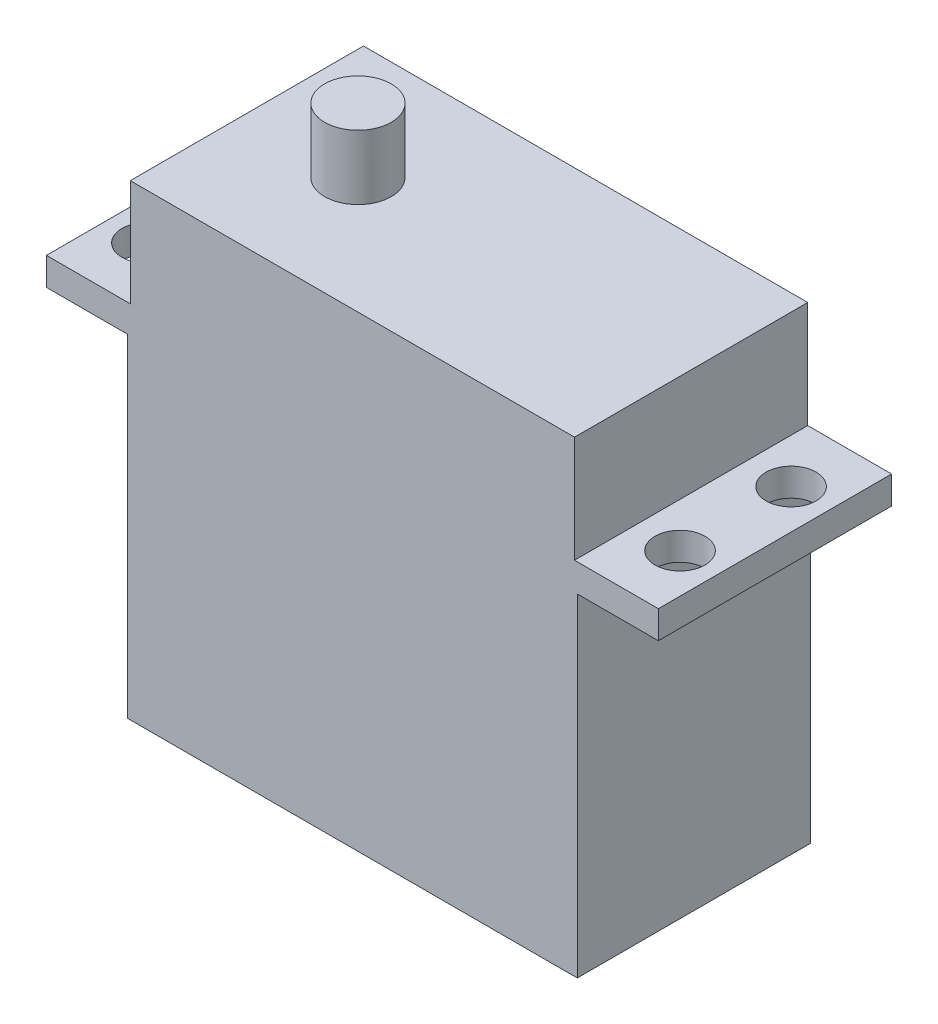
ISO-10303-21;
HEADER;
FILE_DESCRIPTION(('STEP AP214'),'2;1');
FILE_NAME('part.step','',(''),(''),'','','');
FILE_SCHEMA(('AUTOMOTIVE_DESIGN { 1 0 10303 214 1 1 1 1 }'));
ENDSEC;
DATA;
#1=APPLICATION_CONTEXT('core data for automotive mechanical design processes');
#2=APPLICATION_PROTOCOL_DEFINITION('international standard','automotive_design',2000,#1);
#3=PRODUCT_CONTEXT('',#1,'mechanical');
#4=PRODUCT('Part','Part','',(#3));
#5=PRODUCT_RELATED_PRODUCT_CATEGORY('part','',(#4));
#6=PRODUCT_DEFINITION_FORMATION('','',#4);
#7=PRODUCT_DEFINITION_CONTEXT('part definition',#1,'design');
#8=PRODUCT_DEFINITION('design','',#6,#7);
#9=PRODUCT_DEFINITION_SHAPE('','',#8);
#10=(LENGTH_UNIT() NAMED_UNIT(*) SI_UNIT(.MILLI.,.METRE.));
#11=(NAMED_UNIT(*) PLANE_ANGLE_UNIT() SI_UNIT($,.RADIAN.));
#12=(NAMED_UNIT(*) SI_UNIT($,.STERADIAN.) SOLID_ANGLE_UNIT());
#13=UNCERTAINTY_MEASURE_WITH_UNIT(LENGTH_MEASURE(1.E-05),#10,'distance_accuracy_value','');
#14=(GEOMETRIC_REPRESENTATION_CONTEXT(3) GLOBAL_UNCERTAINTY_ASSIGNED_CONTEXT((#13)) GLOBAL_UNIT_ASSIGNED_CONTEXT((#10,
#11,#12)) REPRESENTATION_CONTEXT('',''));
#15=CARTESIAN_POINT('',(0.,0.,0.));
#16=DIRECTION('',(0.,0.,1.));
#17=DIRECTION('',(1.,0.,0.));
#18=AXIS2_PLACEMENT_3D('',#15,#16,#17);
#19=CARTESIAN_POINT('',(0.,32.45,0.));
#20=DIRECTION('',(0.,-1.,0.));
#21=DIRECTION('',(0.,0.,-1.));
#22=AXIS2_PLACEMENT_3D('',#19,#20,#21);
#23=PLANE('',#22);
#24=CARTESIAN_POINT('',(24.,32.45,-5.));
#25=DIRECTION('',(0.,1.,0.));
#26=DIRECTION('',(0.,0.,1.));
#27=AXIS2_PLACEMENT_3D('',#24,#25,#26);
#28=CIRCLE('',#27,2.25);
#29=CARTESIAN_POINT('',(24.,32.45,-2.75));
#30=VERTEX_POINT('',#29);
#31=EDGE_CURVE('E190',#30,#30,#28,.T.);
#32=ORIENTED_EDGE('',*,*,#31,.F.);
#33=EDGE_LOOP('',(#32));
#34=FACE_BOUND('',#33,.T.);
#35=CARTESIAN_POINT('',(24.,32.45,5.));
#36=DIRECTION('',(0.,1.,0.));
#37=DIRECTION('',(0.,0.,-1.));
#38=AXIS2_PLACEMENT_3D('',#35,#36,#37);
#39=CIRCLE('',#38,2.25);
#40=CARTESIAN_POINT('',(24.,32.45,2.75));
#41=VERTEX_POINT('',#40);
#42=EDGE_CURVE('E184',#41,#41,#39,.T.);
#43=ORIENTED_EDGE('',*,*,#42,.F.);
#44=EDGE_LOOP('',(#43));
#45=FACE_BOUND('',#44,.T.);
#46=DIRECTION('',(0.,0.,-1.));
#47=VECTOR('',#46,1.);
#48=CARTESIAN_POINT('',(20.,32.45,10.5));
#49=LINE('',#48,#47);
#50=CARTESIAN_POINT('',(20.,32.45,10.5));
#51=VERTEX_POINT('',#50);
#52=CARTESIAN_POINT('',(20.,32.45,-10.5));
#53=VERTEX_POINT('',#52);
#54=EDGE_CURVE('E147',#51,#53,#49,.T.);
#55=ORIENTED_EDGE('',*,*,#54,.F.);
#56=DIRECTION('',(1.,0.,0.));
#57=VECTOR('',#56,1.);
#58=CARTESIAN_POINT('',(-20.25,32.45,10.5));
#59=LINE('',#58,#57);
#60=CARTESIAN_POINT('',(27.55,32.45,10.5));
#61=VERTEX_POINT('',#60);
#62=EDGE_CURVE('E220',#51,#61,#59,.T.);
#63=ORIENTED_EDGE('',*,*,#62,.T.);
#64=DIRECTION('',(0.,0.,-1.));
#65=VECTOR('',#64,1.);
#66=CARTESIAN_POINT('',(27.55,32.45,10.5));
#67=LINE('',#66,#65);
#68=CARTESIAN_POINT('',(27.55,32.45,-10.5));
#69=VERTEX_POINT('',#68);
#70=EDGE_CURVE('E196',#61,#69,#67,.T.);
#71=ORIENTED_EDGE('',*,*,#70,.T.);
#72=DIRECTION('',(-1.,0.,0.));
#73=VECTOR('',#72,1.);
#74=CARTESIAN_POINT('',(-20.25,32.45,-10.5));
#75=LINE('',#74,#73);
#76=EDGE_CURVE('E59',#69,#53,#75,.T.);
#77=ORIENTED_EDGE('',*,*,#76,.T.);
#78=EDGE_LOOP('',(#55,#63,#71,#77));
#79=FACE_BOUND('',#78,.T.);
#80=ADVANCED_FACE('F36',(#34,#45,#79),#23,.F.);
#81=CARTESIAN_POINT('',(-24.,32.45,5.));
#82=DIRECTION('',(0.,1.,0.));
#83=DIRECTION('',(0.,0.,1.));
#84=AXIS2_PLACEMENT_3D('',#81,#82,#83);
#85=CIRCLE('',#84,2.25);
#86=CARTESIAN_POINT('',(-24.,32.45,7.25));
#87=VERTEX_POINT('',#86);
#88=EDGE_CURVE('E158',#87,#87,#85,.T.);
#89=ORIENTED_EDGE('',*,*,#88,.F.);
#90=EDGE_LOOP('',(#89));
#91=FACE_BOUND('',#90,.T.);
#92=CARTESIAN_POINT('',(-24.,32.45,-5.));
#93=DIRECTION('',(0.,1.,0.));
#94=DIRECTION('',(0.,0.,-1.));
#95=AXIS2_PLACEMENT_3D('',#92,#93,#94);
#96=CIRCLE('',#95,2.25);
#97=CARTESIAN_POINT('',(-24.,32.45,-7.25));
#98=VERTEX_POINT('',#97);
#99=EDGE_CURVE('E148',#98,#98,#96,.T.);
#100=ORIENTED_EDGE('',*,*,#99,.F.);
#101=EDGE_LOOP('',(#100));
#102=FACE_BOUND('',#101,.T.);
#103=DIRECTION('',(0.,0.,1.));
#104=VECTOR('',#103,1.);
#105=CARTESIAN_POINT('',(-20.,32.45,10.5));
#106=LINE('',#105,#104);
#107=CARTESIAN_POINT('',(-20.,32.45,-10.5));
#108=VERTEX_POINT('',#107);
#109=CARTESIAN_POINT('',(-20.,32.45,10.5));
#110=VERTEX_POINT('',#109);
#111=EDGE_CURVE('E51',#108,#110,#106,.T.);
#112=ORIENTED_EDGE('',*,*,#111,.F.);
#113=CARTESIAN_POINT('',(-27.55,32.45,-10.5));
#114=VERTEX_POINT('',#113);
#115=EDGE_CURVE('E221',#108,#114,#75,.T.);
#116=ORIENTED_EDGE('',*,*,#115,.T.);
#117=DIRECTION('',(0.,0.,1.));
#118=VECTOR('',#117,1.);
#119=CARTESIAN_POINT('',(-27.55,32.45,10.5));
#120=LINE('',#119,#118);
#121=CARTESIAN_POINT('',(-27.55,32.45,10.5));
#122=VERTEX_POINT('',#121);
#123=EDGE_CURVE('E163',#114,#122,#120,.T.);
#124=ORIENTED_EDGE('',*,*,#123,.T.);
#125=EDGE_CURVE('E222',#122,#110,#59,.T.);
#126=ORIENTED_EDGE('',*,*,#125,.T.);
#127=EDGE_LOOP('',(#112,#116,#124,#126));
#128=FACE_BOUND('',#127,.T.);
#129=ADVANCED_FACE('F262',(#91,#102,#128),#23,.F.);
#130=CARTESIAN_POINT('',(20.25,32.45,10.5));
#131=DIRECTION('',(-1.,0.,0.));
#132=DIRECTION('',(0.,0.,1.));
#133=AXIS2_PLACEMENT_3D('',#130,#131,#132);
#134=PLANE('',#133);
#135=DIRECTION('',(0.,-1.,0.));
#136=VECTOR('',#135,1.);
#137=CARTESIAN_POINT('',(20.25,32.45,-10.5));
#138=LINE('',#137,#136);
#139=CARTESIAN_POINT('',(20.25,29.95,-10.5));
#140=VERTEX_POINT('',#139);
#141=CARTESIAN_POINT('',(20.25,0.,-10.5));
#142=VERTEX_POINT('',#141);
#143=EDGE_CURVE('E44',#140,#142,#138,.T.);
#144=ORIENTED_EDGE('',*,*,#143,.F.);
#145=DIRECTION('',(0.,0.,1.));
#146=VECTOR('',#145,1.);
#147=CARTESIAN_POINT('',(20.25,29.95,10.5));
#148=LINE('',#147,#146);
#149=CARTESIAN_POINT('',(20.25,29.95,10.5));
#150=VERTEX_POINT('',#149);
#151=EDGE_CURVE('E199',#140,#150,#148,.T.);
#152=ORIENTED_EDGE('',*,*,#151,.T.);
#153=DIRECTION('',(0.,-1.,0.));
#154=VECTOR('',#153,1.);
#155=CARTESIAN_POINT('',(20.25,32.45,10.5));
#156=LINE('',#155,#154);
#157=CARTESIAN_POINT('',(20.25,0.,10.5));
#158=VERTEX_POINT('',#157);
#159=EDGE_CURVE('E224',#150,#158,#156,.T.);
#160=ORIENTED_EDGE('',*,*,#159,.T.);
#161=DIRECTION('',(0.,0.,-1.));
#162=VECTOR('',#161,1.);
#163=CARTESIAN_POINT('',(20.25,0.,10.5));
#164=LINE('',#163,#162);
#165=EDGE_CURVE('E216',#158,#142,#164,.T.);
#166=ORIENTED_EDGE('',*,*,#165,.T.);
#167=EDGE_LOOP('',(#144,#152,#160,#166));
#168=FACE_BOUND('',#167,.T.);
#169=ADVANCED_FACE('F38',(#168),#134,.F.);
#170=CARTESIAN_POINT('',(-20.25,32.45,-10.5));
#171=DIRECTION('',(0.,0.,1.));
#172=DIRECTION('',(1.,0.,0.));
#173=AXIS2_PLACEMENT_3D('',#170,#171,#172);
#174=PLANE('',#173);
#175=DIRECTION('',(-1.,0.,0.));
#176=VECTOR('',#175,1.);
#177=CARTESIAN_POINT('',(-20.25,0.,-10.5));
#178=LINE('',#177,#176);
#179=CARTESIAN_POINT('',(-20.25,0.,-10.5));
#180=VERTEX_POINT('',#179);
#181=EDGE_CURVE('E227',#142,#180,#178,.T.);
#182=ORIENTED_EDGE('',*,*,#181,.T.);
#183=DIRECTION('',(0.,-1.,0.));
#184=VECTOR('',#183,1.);
#185=CARTESIAN_POINT('',(-20.25,32.45,-10.5));
#186=LINE('',#185,#184);
#187=CARTESIAN_POINT('',(-20.25,29.95,-10.5));
#188=VERTEX_POINT('',#187);
#189=EDGE_CURVE('E238',#188,#180,#186,.T.);
#190=ORIENTED_EDGE('',*,*,#189,.F.);
#191=DIRECTION('',(-1.,0.,0.));
#192=VECTOR('',#191,1.);
#193=CARTESIAN_POINT('',(-20.25,29.95,-10.5));
#194=LINE('',#193,#192);
#195=CARTESIAN_POINT('',(-27.55,29.95,-10.5));
#196=VERTEX_POINT('',#195);
#197=EDGE_CURVE('E172',#188,#196,#194,.T.);
#198=ORIENTED_EDGE('',*,*,#197,.T.);
#199=DIRECTION('',(0.,1.,0.));
#200=VECTOR('',#199,1.);
#201=CARTESIAN_POINT('',(-27.55,29.95,-10.5));
#202=LINE('',#201,#200);
#203=EDGE_CURVE('E178',#196,#114,#202,.T.);
#204=ORIENTED_EDGE('',*,*,#203,.T.);
#205=ORIENTED_EDGE('',*,*,#115,.F.);
#206=DIRECTION('',(0.,-1.,0.));
#207=VECTOR('',#206,1.);
#208=CARTESIAN_POINT('',(-20.,42.05,-10.5));
#209=LINE('',#208,#207);
#210=CARTESIAN_POINT('',(-20.,42.05,-10.5));
#211=VERTEX_POINT('',#210);
#212=EDGE_CURVE('E132',#211,#108,#209,.T.);
#213=ORIENTED_EDGE('',*,*,#212,.F.);
#214=DIRECTION('',(-1.,0.,0.));
#215=VECTOR('',#214,1.);
#216=CARTESIAN_POINT('',(-20.,42.05,-10.5));
#217=LINE('',#216,#215);
#218=CARTESIAN_POINT('',(20.,42.05,-10.5));
#219=VERTEX_POINT('',#218);
#220=EDGE_CURVE('E124',#219,#211,#217,.T.);
#221=ORIENTED_EDGE('',*,*,#220,.F.);
#222=DIRECTION('',(0.,-1.,0.));
#223=VECTOR('',#222,1.);
#224=CARTESIAN_POINT('',(20.,42.05,-10.5));
#225=LINE('',#224,#223);
#226=EDGE_CURVE('E129',#219,#53,#225,.T.);
#227=ORIENTED_EDGE('',*,*,#226,.T.);
#228=ORIENTED_EDGE('',*,*,#76,.F.);
#229=DIRECTION('',(0.,1.,0.));
#230=VECTOR('',#229,1.);
#231=CARTESIAN_POINT('',(27.55,29.95,-10.5));
#232=LINE('',#231,#230);
#233=CARTESIAN_POINT('',(27.55,29.95,-10.5));
#234=VERTEX_POINT('',#233);
#235=EDGE_CURVE('E213',#234,#69,#232,.T.);
#236=ORIENTED_EDGE('',*,*,#235,.F.);
#237=DIRECTION('',(-1.,0.,0.));
#238=VECTOR('',#237,1.);
#239=CARTESIAN_POINT('',(20.25,29.95,-10.5));
#240=LINE('',#239,#238);
#241=EDGE_CURVE('E208',#234,#140,#240,.T.);
#242=ORIENTED_EDGE('',*,*,#241,.T.);
#243=ORIENTED_EDGE('',*,*,#143,.T.);
#244=EDGE_LOOP('',(#182,#190,#198,#204,#205,#213,#221,#227,#228,#236,#242,#243));
#245=FACE_BOUND('',#244,.T.);
#246=ADVANCED_FACE('F127',(#245),#174,.F.);
#247=CARTESIAN_POINT('',(-20.25,32.45,10.5));
#248=DIRECTION('',(1.,0.,0.));
#249=DIRECTION('',(0.,0.,-1.));
#250=AXIS2_PLACEMENT_3D('',#247,#248,#249);
#251=PLANE('',#250);
#252=DIRECTION('',(0.,-1.,0.));
#253=VECTOR('',#252,1.);
#254=CARTESIAN_POINT('',(-20.25,32.45,10.5));
#255=LINE('',#254,#253);
#256=CARTESIAN_POINT('',(-20.25,29.95,10.5));
#257=VERTEX_POINT('',#256);
#258=CARTESIAN_POINT('',(-20.25,0.,10.5));
#259=VERTEX_POINT('',#258);
#260=EDGE_CURVE('E236',#257,#259,#255,.T.);
#261=ORIENTED_EDGE('',*,*,#260,.F.);
#262=DIRECTION('',(0.,0.,-1.));
#263=VECTOR('',#262,1.);
#264=CARTESIAN_POINT('',(-20.25,29.95,10.5));
#265=LINE('',#264,#263);
#266=EDGE_CURVE('E169',#257,#188,#265,.T.);
#267=ORIENTED_EDGE('',*,*,#266,.T.);
#268=ORIENTED_EDGE('',*,*,#189,.T.);
#269=DIRECTION('',(0.,0.,1.));
#270=VECTOR('',#269,1.);
#271=CARTESIAN_POINT('',(-20.25,0.,10.5));
#272=LINE('',#271,#270);
#273=EDGE_CURVE('E229',#180,#259,#272,.T.);
#274=ORIENTED_EDGE('',*,*,#273,.T.);
#275=EDGE_LOOP('',(#261,#267,#268,#274));
#276=FACE_BOUND('',#275,.T.);
#277=ADVANCED_FACE('F255',(#276),#251,.F.);
#278=CARTESIAN_POINT('',(-20.25,32.45,10.5));
#279=DIRECTION('',(0.,0.,-1.));
#280=DIRECTION('',(-1.,0.,0.));
#281=AXIS2_PLACEMENT_3D('',#278,#279,#280);
#282=PLANE('',#281);
#283=DIRECTION('',(1.,0.,0.));
#284=VECTOR('',#283,1.);
#285=CARTESIAN_POINT('',(-20.25,0.,10.5));
#286=LINE('',#285,#284);
#287=EDGE_CURVE('E232',#259,#158,#286,.T.);
#288=ORIENTED_EDGE('',*,*,#287,.T.);
#289=ORIENTED_EDGE('',*,*,#159,.F.);
#290=DIRECTION('',(1.,0.,0.));
#291=VECTOR('',#290,1.);
#292=CARTESIAN_POINT('',(20.25,29.95,10.5));
#293=LINE('',#292,#291);
#294=CARTESIAN_POINT('',(27.55,29.95,10.5));
#295=VERTEX_POINT('',#294);
#296=EDGE_CURVE('E202',#150,#295,#293,.T.);
#297=ORIENTED_EDGE('',*,*,#296,.T.);
#298=DIRECTION('',(0.,1.,0.));
#299=VECTOR('',#298,1.);
#300=CARTESIAN_POINT('',(27.55,29.95,10.5));
#301=LINE('',#300,#299);
#302=EDGE_CURVE('E211',#295,#61,#301,.T.);
#303=ORIENTED_EDGE('',*,*,#302,.T.);
#304=ORIENTED_EDGE('',*,*,#62,.F.);
#305=DIRECTION('',(0.,-1.,0.));
#306=VECTOR('',#305,1.);
#307=CARTESIAN_POINT('',(20.,42.05,10.5));
#308=LINE('',#307,#306);
#309=CARTESIAN_POINT('',(20.,42.05,10.5));
#310=VERTEX_POINT('',#309);
#311=EDGE_CURVE('E268',#310,#51,#308,.T.);
#312=ORIENTED_EDGE('',*,*,#311,.F.);
#313=DIRECTION('',(1.,0.,0.));
#314=VECTOR('',#313,1.);
#315=CARTESIAN_POINT('',(-20.,42.05,10.5));
#316=LINE('',#315,#314);
#317=CARTESIAN_POINT('',(-20.,42.05,10.5));
#318=VERTEX_POINT('',#317);
#319=EDGE_CURVE('E141',#318,#310,#316,.T.);
#320=ORIENTED_EDGE('',*,*,#319,.F.);
#321=DIRECTION('',(0.,-1.,0.));
#322=VECTOR('',#321,1.);
#323=CARTESIAN_POINT('',(-20.,42.05,10.5));
#324=LINE('',#323,#322);
#325=EDGE_CURVE('E153',#318,#110,#324,.T.);
#326=ORIENTED_EDGE('',*,*,#325,.T.);
#327=ORIENTED_EDGE('',*,*,#125,.F.);
#328=DIRECTION('',(0.,1.,0.));
#329=VECTOR('',#328,1.);
#330=CARTESIAN_POINT('',(-27.55,29.95,10.5));
#331=LINE('',#330,#329);
#332=CARTESIAN_POINT('',(-27.55,29.95,10.5));
#333=VERTEX_POINT('',#332);
#334=EDGE_CURVE('E181',#333,#122,#331,.T.);
#335=ORIENTED_EDGE('',*,*,#334,.F.);
#336=DIRECTION('',(1.,0.,0.));
#337=VECTOR('',#336,1.);
#338=CARTESIAN_POINT('',(-20.25,29.95,10.5));
#339=LINE('',#338,#337);
#340=EDGE_CURVE('E166',#333,#257,#339,.T.);
#341=ORIENTED_EDGE('',*,*,#340,.T.);
#342=ORIENTED_EDGE('',*,*,#260,.T.);
#343=EDGE_LOOP('',(#288,#289,#297,#303,#304,#312,#320,#326,#327,#335,#341,#342));
#344=FACE_BOUND('',#343,.T.);
#345=ADVANCED_FACE('F251',(#344),#282,.F.);
#346=CARTESIAN_POINT('',(0.,0.,0.));
#347=DIRECTION('',(0.,-1.,0.));
#348=DIRECTION('',(0.,0.,-1.));
#349=AXIS2_PLACEMENT_3D('',#346,#347,#348);
#350=PLANE('',#349);
#351=ORIENTED_EDGE('',*,*,#165,.F.);
#352=ORIENTED_EDGE('',*,*,#287,.F.);
#353=ORIENTED_EDGE('',*,*,#273,.F.);
#354=ORIENTED_EDGE('',*,*,#181,.F.);
#355=EDGE_LOOP('',(#351,#352,#353,#354));
#356=FACE_BOUND('',#355,.T.);
#357=ADVANCED_FACE('F247',(#356),#350,.T.);
#358=CARTESIAN_POINT('',(27.55,29.95,10.5));
#359=DIRECTION('',(1.,0.,0.));
#360=DIRECTION('',(0.,0.,-1.));
#361=AXIS2_PLACEMENT_3D('',#358,#359,#360);
#362=PLANE('',#361);
#363=ORIENTED_EDGE('',*,*,#70,.F.);
#364=ORIENTED_EDGE('',*,*,#302,.F.);
#365=DIRECTION('',(0.,0.,-1.));
#366=VECTOR('',#365,1.);
#367=CARTESIAN_POINT('',(27.55,29.95,10.5));
#368=LINE('',#367,#366);
#369=EDGE_CURVE('E205',#295,#234,#368,.T.);
#370=ORIENTED_EDGE('',*,*,#369,.T.);
#371=ORIENTED_EDGE('',*,*,#235,.T.);
#372=EDGE_LOOP('',(#363,#364,#370,#371));
#373=FACE_BOUND('',#372,.T.);
#374=ADVANCED_FACE('F277',(#373),#362,.T.);
#375=CARTESIAN_POINT('',(0.,29.95,0.));
#376=DIRECTION('',(0.,-1.,0.));
#377=DIRECTION('',(0.,0.,-1.));
#378=AXIS2_PLACEMENT_3D('',#375,#376,#377);
#379=PLANE('',#378);
#380=CARTESIAN_POINT('',(24.,29.95,5.));
#381=DIRECTION('',(0.,1.,0.));
#382=DIRECTION('',(0.,0.,-1.));
#383=AXIS2_PLACEMENT_3D('',#380,#381,#382);
#384=CIRCLE('',#383,2.25);
#385=CARTESIAN_POINT('',(24.,29.95,2.75));
#386=VERTEX_POINT('',#385);
#387=EDGE_CURVE('E187',#386,#386,#384,.T.);
#388=ORIENTED_EDGE('',*,*,#387,.T.);
#389=EDGE_LOOP('',(#388));
#390=FACE_BOUND('',#389,.T.);
#391=CARTESIAN_POINT('',(24.,29.95,-5.));
#392=DIRECTION('',(0.,1.,0.));
#393=DIRECTION('',(0.,0.,1.));
#394=AXIS2_PLACEMENT_3D('',#391,#392,#393);
#395=CIRCLE('',#394,2.25);
#396=CARTESIAN_POINT('',(24.,29.95,-2.75));
#397=VERTEX_POINT('',#396);
#398=EDGE_CURVE('E193',#397,#397,#395,.T.);
#399=ORIENTED_EDGE('',*,*,#398,.T.);
#400=EDGE_LOOP('',(#399));
#401=FACE_BOUND('',#400,.T.);
#402=ORIENTED_EDGE('',*,*,#151,.F.);
#403=ORIENTED_EDGE('',*,*,#241,.F.);
#404=ORIENTED_EDGE('',*,*,#369,.F.);
#405=ORIENTED_EDGE('',*,*,#296,.F.);
#406=EDGE_LOOP('',(#402,#403,#404,#405));
#407=FACE_BOUND('',#406,.T.);
#408=ADVANCED_FACE('F280',(#390,#401,#407),#379,.T.);
#409=CARTESIAN_POINT('',(24.,29.95,-5.));
#410=DIRECTION('',(0.,1.,0.));
#411=DIRECTION('',(0.,0.,1.));
#412=AXIS2_PLACEMENT_3D('',#409,#410,#411);
#413=CYLINDRICAL_SURFACE('',#412,2.25);
#414=ORIENTED_EDGE('',*,*,#398,.F.);
#415=EDGE_LOOP('',(#414));
#416=FACE_BOUND('',#415,.T.);
#417=ORIENTED_EDGE('',*,*,#31,.T.);
#418=EDGE_LOOP('',(#417));
#419=FACE_BOUND('',#418,.T.);
#420=ADVANCED_FACE('F282',(#416,#419),#413,.F.);
#421=CARTESIAN_POINT('',(24.,29.95,5.));
#422=DIRECTION('',(0.,1.,0.));
#423=DIRECTION('',(0.,0.,1.));
#424=AXIS2_PLACEMENT_3D('',#421,#422,#423);
#425=CYLINDRICAL_SURFACE('',#424,2.25);
#426=ORIENTED_EDGE('',*,*,#387,.F.);
#427=EDGE_LOOP('',(#426));
#428=FACE_BOUND('',#427,.T.);
#429=ORIENTED_EDGE('',*,*,#42,.T.);
#430=EDGE_LOOP('',(#429));
#431=FACE_BOUND('',#430,.T.);
#432=ADVANCED_FACE('F289',(#428,#431),#425,.F.);
#433=CARTESIAN_POINT('',(-27.55,29.95,10.5));
#434=DIRECTION('',(-1.,0.,0.));
#435=DIRECTION('',(0.,0.,1.));
#436=AXIS2_PLACEMENT_3D('',#433,#434,#435);
#437=PLANE('',#436);
#438=ORIENTED_EDGE('',*,*,#123,.F.);
#439=ORIENTED_EDGE('',*,*,#203,.F.);
#440=DIRECTION('',(0.,0.,1.));
#441=VECTOR('',#440,1.);
#442=CARTESIAN_POINT('',(-27.55,29.95,10.5));
#443=LINE('',#442,#441);
#444=EDGE_CURVE('E175',#196,#333,#443,.T.);
#445=ORIENTED_EDGE('',*,*,#444,.T.);
#446=ORIENTED_EDGE('',*,*,#334,.T.);
#447=EDGE_LOOP('',(#438,#439,#445,#446));
#448=FACE_BOUND('',#447,.T.);
#449=ADVANCED_FACE('F261',(#448),#437,.T.);
#450=CARTESIAN_POINT('',(0.,29.95,0.));
#451=DIRECTION('',(0.,-1.,0.));
#452=DIRECTION('',(0.,0.,-1.));
#453=AXIS2_PLACEMENT_3D('',#450,#451,#452);
#454=PLANE('',#453);
#455=CARTESIAN_POINT('',(-24.,29.95,-5.));
#456=DIRECTION('',(0.,1.,0.));
#457=DIRECTION('',(0.,0.,-1.));
#458=AXIS2_PLACEMENT_3D('',#455,#456,#457);
#459=CIRCLE('',#458,2.25);
#460=CARTESIAN_POINT('',(-24.,29.95,-7.25));
#461=VERTEX_POINT('',#460);
#462=EDGE_CURVE('E151',#461,#461,#459,.T.);
#463=ORIENTED_EDGE('',*,*,#462,.T.);
#464=EDGE_LOOP('',(#463));
#465=FACE_BOUND('',#464,.T.);
#466=CARTESIAN_POINT('',(-24.,29.95,5.));
#467=DIRECTION('',(0.,1.,0.));
#468=DIRECTION('',(0.,0.,1.));
#469=AXIS2_PLACEMENT_3D('',#466,#467,#468);
#470=CIRCLE('',#469,2.25);
#471=CARTESIAN_POINT('',(-24.,29.95,7.25));
#472=VERTEX_POINT('',#471);
#473=EDGE_CURVE('E160',#472,#472,#470,.T.);
#474=ORIENTED_EDGE('',*,*,#473,.T.);
#475=EDGE_LOOP('',(#474));
#476=FACE_BOUND('',#475,.T.);
#477=ORIENTED_EDGE('',*,*,#340,.F.);
#478=ORIENTED_EDGE('',*,*,#444,.F.);
#479=ORIENTED_EDGE('',*,*,#197,.F.);
#480=ORIENTED_EDGE('',*,*,#266,.F.);
#481=EDGE_LOOP('',(#477,#478,#479,#480));
#482=FACE_BOUND('',#481,.T.);
#483=ADVANCED_FACE('F259',(#465,#476,#482),#454,.T.);
#484=CARTESIAN_POINT('',(-24.,29.95,5.));
#485=DIRECTION('',(0.,1.,0.));
#486=DIRECTION('',(0.,0.,1.));
#487=AXIS2_PLACEMENT_3D('',#484,#485,#486);
#488=CYLINDRICAL_SURFACE('',#487,2.25);
#489=ORIENTED_EDGE('',*,*,#473,.F.);
#490=EDGE_LOOP('',(#489));
#491=FACE_BOUND('',#490,.T.);
#492=ORIENTED_EDGE('',*,*,#88,.T.);
#493=EDGE_LOOP('',(#492));
#494=FACE_BOUND('',#493,.T.);
#495=ADVANCED_FACE('F392',(#491,#494),#488,.F.);
#496=CARTESIAN_POINT('',(-24.,29.95,-5.));
#497=DIRECTION('',(0.,1.,0.));
#498=DIRECTION('',(0.,0.,1.));
#499=AXIS2_PLACEMENT_3D('',#496,#497,#498);
#500=CYLINDRICAL_SURFACE('',#499,2.25);
#501=ORIENTED_EDGE('',*,*,#462,.F.);
#502=EDGE_LOOP('',(#501));
#503=FACE_BOUND('',#502,.T.);
#504=ORIENTED_EDGE('',*,*,#99,.T.);
#505=EDGE_LOOP('',(#504));
#506=FACE_BOUND('',#505,.T.);
#507=ADVANCED_FACE('F347',(#503,#506),#500,.F.);
#508=CARTESIAN_POINT('',(20.,42.05,10.5));
#509=DIRECTION('',(-1.,0.,0.));
#510=DIRECTION('',(0.,0.,1.));
#511=AXIS2_PLACEMENT_3D('',#508,#509,#510);
#512=PLANE('',#511);
#513=ORIENTED_EDGE('',*,*,#54,.T.);
#514=ORIENTED_EDGE('',*,*,#226,.F.);
#515=DIRECTION('',(0.,0.,-1.));
#516=VECTOR('',#515,1.);
#517=CARTESIAN_POINT('',(20.,42.05,10.5));
#518=LINE('',#517,#516);
#519=EDGE_CURVE('E136',#310,#219,#518,.T.);
#520=ORIENTED_EDGE('',*,*,#519,.F.);
#521=ORIENTED_EDGE('',*,*,#311,.T.);
#522=EDGE_LOOP('',(#513,#514,#520,#521));
#523=FACE_BOUND('',#522,.T.);
#524=ADVANCED_FACE('F146',(#523),#512,.F.);
#525=CARTESIAN_POINT('',(-20.,42.05,10.5));
#526=DIRECTION('',(1.,0.,0.));
#527=DIRECTION('',(0.,0.,-1.));
#528=AXIS2_PLACEMENT_3D('',#525,#526,#527);
#529=PLANE('',#528);
#530=ORIENTED_EDGE('',*,*,#111,.T.);
#531=ORIENTED_EDGE('',*,*,#325,.F.);
#532=DIRECTION('',(0.,0.,1.));
#533=VECTOR('',#532,1.);
#534=CARTESIAN_POINT('',(-20.,42.05,10.5));
#535=LINE('',#534,#533);
#536=EDGE_CURVE('E135',#211,#318,#535,.T.);
#537=ORIENTED_EDGE('',*,*,#536,.F.);
#538=ORIENTED_EDGE('',*,*,#212,.T.);
#539=EDGE_LOOP('',(#530,#531,#537,#538));
#540=FACE_BOUND('',#539,.T.);
#541=ADVANCED_FACE('F264',(#540),#529,.F.);
#542=CARTESIAN_POINT('',(0.,42.05,0.));
#543=DIRECTION('',(0.,-1.,0.));
#544=DIRECTION('',(0.,0.,-1.));
#545=AXIS2_PLACEMENT_3D('',#542,#543,#544);
#546=PLANE('',#545);
#547=CARTESIAN_POINT('',(-10.,42.05,0.));
#548=DIRECTION('',(0.,-1.,0.));
#549=DIRECTION('',(0.,0.,-1.));
#550=AXIS2_PLACEMENT_3D('',#547,#548,#549);
#551=CIRCLE('',#550,3.);
#552=CARTESIAN_POINT('',(-10.,42.05,-3.));
#553=VERTEX_POINT('',#552);
#554=EDGE_CURVE('E11',#553,#553,#551,.F.);
#555=ORIENTED_EDGE('',*,*,#554,.F.);
#556=EDGE_LOOP('',(#555));
#557=FACE_BOUND('',#556,.T.);
#558=ORIENTED_EDGE('',*,*,#519,.T.);
#559=ORIENTED_EDGE('',*,*,#220,.T.);
#560=ORIENTED_EDGE('',*,*,#536,.T.);
#561=ORIENTED_EDGE('',*,*,#319,.T.);
#562=EDGE_LOOP('',(#558,#559,#560,#561));
#563=FACE_BOUND('',#562,.T.);
#564=ADVANCED_FACE('F139',(#557,#563),#546,.F.);
#565=CARTESIAN_POINT('',(-10.,47.85,0.));
#566=DIRECTION('',(0.,-1.,0.));
#567=DIRECTION('',(0.,0.,-1.));
#568=AXIS2_PLACEMENT_3D('',#565,#566,#567);
#569=CYLINDRICAL_SURFACE('',#568,3.);
#570=CARTESIAN_POINT('',(-10.,47.85,0.));
#571=DIRECTION('',(0.,1.,0.));
#572=DIRECTION('',(0.,0.,1.));
#573=AXIS2_PLACEMENT_3D('',#570,#571,#572);
#574=CIRCLE('',#573,3.);
#575=CARTESIAN_POINT('',(-10.,47.85,3.));
#576=VERTEX_POINT('',#575);
#577=EDGE_CURVE('E272',#576,#576,#574,.T.);
#578=ORIENTED_EDGE('',*,*,#577,.F.);
#579=EDGE_LOOP('',(#578));
#580=FACE_BOUND('',#579,.T.);
#581=ORIENTED_EDGE('',*,*,#554,.T.);
#582=EDGE_LOOP('',(#581));
#583=FACE_BOUND('',#582,.T.);
#584=ADVANCED_FACE('F365',(#580,#583),#569,.T.);
#585=CARTESIAN_POINT('',(-10.,47.85,0.));
#586=DIRECTION('',(0.,1.,0.));
#587=DIRECTION('',(0.,0.,1.));
#588=AXIS2_PLACEMENT_3D('',#585,#586,#587);
#589=PLANE('',#588);
#590=ORIENTED_EDGE('',*,*,#577,.T.);
#591=EDGE_LOOP('',(#590));
#592=FACE_BOUND('',#591,.T.);
#593=ADVANCED_FACE('F375',(#592),#589,.T.);
#594=CLOSED_SHELL('',(#80,#129,#169,#246,#277,#345,#357,#374,#408,#420,#432,#449,#483,#495,#507,
#524,#541,#564,#584,#593));
#595=MANIFOLD_SOLID_BREP('B2',#594);
#596=ADVANCED_BREP_SHAPE_REPRESENTATION('',(#18,#595),#14);
#597=SHAPE_DEFINITION_REPRESENTATION(#9,#596);
ENDSEC;
END-ISO-10303-21;
